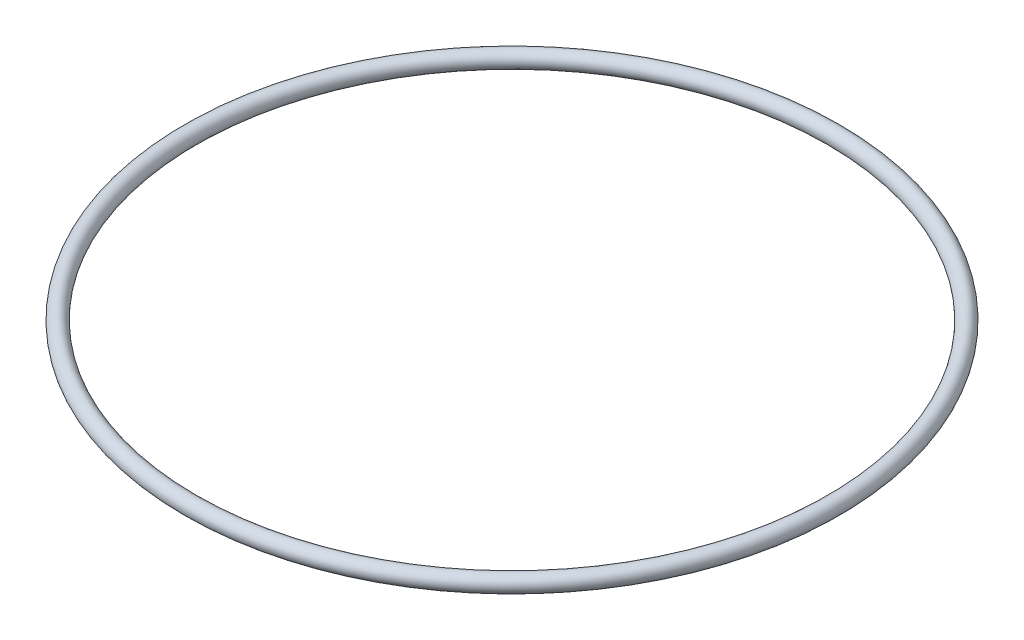
ISO-10303-21;
HEADER;
FILE_DESCRIPTION(('STEP AP214'),'2;1');
FILE_NAME('part.step','',(''),(''),'','','');
FILE_SCHEMA(('AUTOMOTIVE_DESIGN { 1 0 10303 214 1 1 1 1 }'));
ENDSEC;
DATA;
#1=APPLICATION_CONTEXT('core data for automotive mechanical design processes');
#2=APPLICATION_PROTOCOL_DEFINITION('international standard','automotive_design',2000,#1);
#3=PRODUCT_CONTEXT('',#1,'mechanical');
#4=PRODUCT('Part','Part','',(#3));
#5=PRODUCT_RELATED_PRODUCT_CATEGORY('part','',(#4));
#6=PRODUCT_DEFINITION_FORMATION('','',#4);
#7=PRODUCT_DEFINITION_CONTEXT('part definition',#1,'design');
#8=PRODUCT_DEFINITION('design','',#6,#7);
#9=PRODUCT_DEFINITION_SHAPE('','',#8);
#10=(LENGTH_UNIT() NAMED_UNIT(*) SI_UNIT(.MILLI.,.METRE.));
#11=(NAMED_UNIT(*) PLANE_ANGLE_UNIT() SI_UNIT($,.RADIAN.));
#12=(NAMED_UNIT(*) SI_UNIT($,.STERADIAN.) SOLID_ANGLE_UNIT());
#13=UNCERTAINTY_MEASURE_WITH_UNIT(LENGTH_MEASURE(1.E-05),#10,'distance_accuracy_value','');
#14=(GEOMETRIC_REPRESENTATION_CONTEXT(3) GLOBAL_UNCERTAINTY_ASSIGNED_CONTEXT((#13)) GLOBAL_UNIT_ASSIGNED_CONTEXT((#10,
#11,#12)) REPRESENTATION_CONTEXT('',''));
#15=CARTESIAN_POINT('',(0.,0.,0.));
#16=DIRECTION('',(0.,0.,1.));
#17=DIRECTION('',(1.,0.,0.));
#18=AXIS2_PLACEMENT_3D('',#15,#16,#17);
#19=CARTESIAN_POINT('',(0.,0.,0.));
#20=DIRECTION('',(0.,-1.,0.));
#21=DIRECTION('',(0.,0.,-1.));
#22=AXIS2_PLACEMENT_3D('',#19,#20,#21);
#23=TOROIDAL_SURFACE('',#22,39.,1.);
#24=CARTESIAN_POINT('',(0.,0.,-40.));
#25=VERTEX_POINT('',#24);
#26=VERTEX_LOOP('',#25);
#27=FACE_BOUND('',#26,.T.);
#28=ADVANCED_FACE('F33',(#27),#23,.T.);
#29=CLOSED_SHELL('',(#28));
#30=MANIFOLD_SOLID_BREP('B2',#29);
#31=ADVANCED_BREP_SHAPE_REPRESENTATION('',(#18,#30),#14);
#32=SHAPE_DEFINITION_REPRESENTATION(#9,#31);
ENDSEC;
END-ISO-10303-21;
